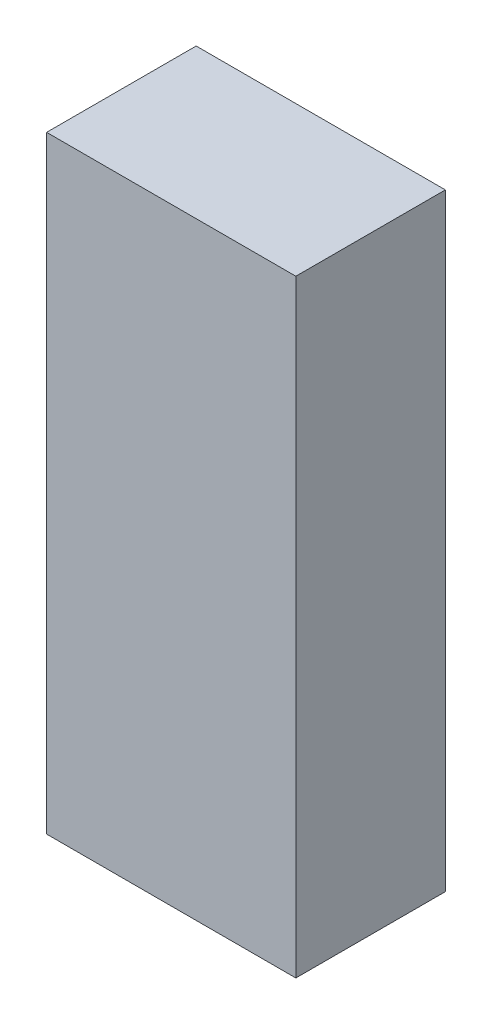
ISO-10303-21;
HEADER;
FILE_DESCRIPTION(('STEP AP214'),'2;1');
FILE_NAME('part.step','',(''),(''),'','','');
FILE_SCHEMA(('AUTOMOTIVE_DESIGN { 1 0 10303 214 1 1 1 1 }'));
ENDSEC;
DATA;
#1=APPLICATION_CONTEXT('core data for automotive mechanical design processes');
#2=APPLICATION_PROTOCOL_DEFINITION('international standard','automotive_design',2000,#1);
#3=PRODUCT_CONTEXT('',#1,'mechanical');
#4=PRODUCT('Part','Part','',(#3));
#5=PRODUCT_RELATED_PRODUCT_CATEGORY('part','',(#4));
#6=PRODUCT_DEFINITION_FORMATION('','',#4);
#7=PRODUCT_DEFINITION_CONTEXT('part definition',#1,'design');
#8=PRODUCT_DEFINITION('design','',#6,#7);
#9=PRODUCT_DEFINITION_SHAPE('','',#8);
#10=(LENGTH_UNIT() NAMED_UNIT(*) SI_UNIT(.MILLI.,.METRE.));
#11=(NAMED_UNIT(*) PLANE_ANGLE_UNIT() SI_UNIT($,.RADIAN.));
#12=(NAMED_UNIT(*) SI_UNIT($,.STERADIAN.) SOLID_ANGLE_UNIT());
#13=UNCERTAINTY_MEASURE_WITH_UNIT(LENGTH_MEASURE(1.E-05),#10,'distance_accuracy_value','');
#14=(GEOMETRIC_REPRESENTATION_CONTEXT(3) GLOBAL_UNCERTAINTY_ASSIGNED_CONTEXT((#13)) GLOBAL_UNIT_ASSIGNED_CONTEXT((#10,
#11,#12)) REPRESENTATION_CONTEXT('',''));
#15=CARTESIAN_POINT('',(0.,0.,0.));
#16=DIRECTION('',(0.,0.,1.));
#17=DIRECTION('',(1.,0.,0.));
#18=AXIS2_PLACEMENT_3D('',#15,#16,#17);
#19=CARTESIAN_POINT('',(7.75,-18.9,9.3));
#20=DIRECTION('',(-1.,0.,0.));
#21=DIRECTION('',(0.,0.,1.));
#22=AXIS2_PLACEMENT_3D('',#19,#20,#21);
#23=PLANE('',#22);
#24=DIRECTION('',(0.,1.,0.));
#25=VECTOR('',#24,1.);
#26=CARTESIAN_POINT('',(7.75,-18.9,0.));
#27=LINE('',#26,#25);
#28=CARTESIAN_POINT('',(7.75,-18.9,0.));
#29=VERTEX_POINT('',#28);
#30=CARTESIAN_POINT('',(7.75,18.9,0.));
#31=VERTEX_POINT('',#30);
#32=EDGE_CURVE('E102',#29,#31,#27,.T.);
#33=ORIENTED_EDGE('',*,*,#32,.T.);
#34=DIRECTION('',(0.,0.,-1.));
#35=VECTOR('',#34,1.);
#36=CARTESIAN_POINT('',(7.75,18.9,9.3));
#37=LINE('',#36,#35);
#38=CARTESIAN_POINT('',(7.75,18.9,9.3));
#39=VERTEX_POINT('',#38);
#40=EDGE_CURVE('E11',#39,#31,#37,.T.);
#41=ORIENTED_EDGE('',*,*,#40,.F.);
#42=DIRECTION('',(0.,1.,0.));
#43=VECTOR('',#42,1.);
#44=CARTESIAN_POINT('',(7.75,-18.9,9.3));
#45=LINE('',#44,#43);
#46=CARTESIAN_POINT('',(7.75,-18.9,9.3));
#47=VERTEX_POINT('',#46);
#48=EDGE_CURVE('E90',#47,#39,#45,.T.);
#49=ORIENTED_EDGE('',*,*,#48,.F.);
#50=DIRECTION('',(0.,0.,-1.));
#51=VECTOR('',#50,1.);
#52=CARTESIAN_POINT('',(7.75,-18.9,9.3));
#53=LINE('',#52,#51);
#54=EDGE_CURVE('E98',#47,#29,#53,.T.);
#55=ORIENTED_EDGE('',*,*,#54,.T.);
#56=EDGE_LOOP('',(#33,#41,#49,#55));
#57=FACE_BOUND('',#56,.T.);
#58=ADVANCED_FACE('F39',(#57),#23,.F.);
#59=CARTESIAN_POINT('',(-7.75,18.9,9.3));
#60=DIRECTION('',(0.,-1.,0.));
#61=DIRECTION('',(0.,0.,-1.));
#62=AXIS2_PLACEMENT_3D('',#59,#60,#61);
#63=PLANE('',#62);
#64=DIRECTION('',(-1.,0.,0.));
#65=VECTOR('',#64,1.);
#66=CARTESIAN_POINT('',(-7.75,18.9,0.));
#67=LINE('',#66,#65);
#68=CARTESIAN_POINT('',(-7.75,18.9,0.));
#69=VERTEX_POINT('',#68);
#70=EDGE_CURVE('E94',#31,#69,#67,.T.);
#71=ORIENTED_EDGE('',*,*,#70,.T.);
#72=DIRECTION('',(0.,0.,-1.));
#73=VECTOR('',#72,1.);
#74=CARTESIAN_POINT('',(-7.75,18.9,9.3));
#75=LINE('',#74,#73);
#76=CARTESIAN_POINT('',(-7.75,18.9,9.3));
#77=VERTEX_POINT('',#76);
#78=EDGE_CURVE('E47',#77,#69,#75,.T.);
#79=ORIENTED_EDGE('',*,*,#78,.F.);
#80=DIRECTION('',(-1.,0.,0.));
#81=VECTOR('',#80,1.);
#82=CARTESIAN_POINT('',(-7.75,18.9,9.3));
#83=LINE('',#82,#81);
#84=EDGE_CURVE('E85',#39,#77,#83,.T.);
#85=ORIENTED_EDGE('',*,*,#84,.F.);
#86=ORIENTED_EDGE('',*,*,#40,.T.);
#87=EDGE_LOOP('',(#71,#79,#85,#86));
#88=FACE_BOUND('',#87,.T.);
#89=ADVANCED_FACE('F93',(#88),#63,.F.);
#90=CARTESIAN_POINT('',(-7.75,-18.9,9.3));
#91=DIRECTION('',(1.,0.,0.));
#92=DIRECTION('',(0.,0.,-1.));
#93=AXIS2_PLACEMENT_3D('',#90,#91,#92);
#94=PLANE('',#93);
#95=DIRECTION('',(0.,-1.,0.));
#96=VECTOR('',#95,1.);
#97=CARTESIAN_POINT('',(-7.75,-18.9,0.));
#98=LINE('',#97,#96);
#99=CARTESIAN_POINT('',(-7.75,-18.9,0.));
#100=VERTEX_POINT('',#99);
#101=EDGE_CURVE('E72',#69,#100,#98,.T.);
#102=ORIENTED_EDGE('',*,*,#101,.T.);
#103=DIRECTION('',(0.,0.,-1.));
#104=VECTOR('',#103,1.);
#105=CARTESIAN_POINT('',(-7.75,-18.9,9.3));
#106=LINE('',#105,#104);
#107=CARTESIAN_POINT('',(-7.75,-18.9,9.3));
#108=VERTEX_POINT('',#107);
#109=EDGE_CURVE('E95',#108,#100,#106,.T.);
#110=ORIENTED_EDGE('',*,*,#109,.F.);
#111=DIRECTION('',(0.,-1.,0.));
#112=VECTOR('',#111,1.);
#113=CARTESIAN_POINT('',(-7.75,-18.9,9.3));
#114=LINE('',#113,#112);
#115=EDGE_CURVE('E88',#77,#108,#114,.T.);
#116=ORIENTED_EDGE('',*,*,#115,.F.);
#117=ORIENTED_EDGE('',*,*,#78,.T.);
#118=EDGE_LOOP('',(#102,#110,#116,#117));
#119=FACE_BOUND('',#118,.T.);
#120=ADVANCED_FACE('F96',(#119),#94,.F.);
#121=CARTESIAN_POINT('',(-7.75,-18.9,9.3));
#122=DIRECTION('',(0.,1.,0.));
#123=DIRECTION('',(0.,0.,1.));
#124=AXIS2_PLACEMENT_3D('',#121,#122,#123);
#125=PLANE('',#124);
#126=DIRECTION('',(1.,0.,0.));
#127=VECTOR('',#126,1.);
#128=CARTESIAN_POINT('',(-7.75,-18.9,0.));
#129=LINE('',#128,#127);
#130=EDGE_CURVE('E78',#100,#29,#129,.T.);
#131=ORIENTED_EDGE('',*,*,#130,.T.);
#132=ORIENTED_EDGE('',*,*,#54,.F.);
#133=DIRECTION('',(1.,0.,0.));
#134=VECTOR('',#133,1.);
#135=CARTESIAN_POINT('',(-7.75,-18.9,9.3));
#136=LINE('',#135,#134);
#137=EDGE_CURVE('E55',#108,#47,#136,.T.);
#138=ORIENTED_EDGE('',*,*,#137,.F.);
#139=ORIENTED_EDGE('',*,*,#109,.T.);
#140=EDGE_LOOP('',(#131,#132,#138,#139));
#141=FACE_BOUND('',#140,.T.);
#142=ADVANCED_FACE('F109',(#141),#125,.F.);
#143=CARTESIAN_POINT('',(0.,0.,9.3));
#144=DIRECTION('',(0.,0.,-1.));
#145=DIRECTION('',(-1.,0.,0.));
#146=AXIS2_PLACEMENT_3D('',#143,#144,#145);
#147=PLANE('',#146);
#148=ORIENTED_EDGE('',*,*,#48,.T.);
#149=ORIENTED_EDGE('',*,*,#84,.T.);
#150=ORIENTED_EDGE('',*,*,#115,.T.);
#151=ORIENTED_EDGE('',*,*,#137,.T.);
#152=EDGE_LOOP('',(#148,#149,#150,#151));
#153=FACE_BOUND('',#152,.T.);
#154=ADVANCED_FACE('F86',(#153),#147,.F.);
#155=CARTESIAN_POINT('',(0.,0.,0.));
#156=DIRECTION('',(0.,0.,-1.));
#157=DIRECTION('',(-1.,0.,0.));
#158=AXIS2_PLACEMENT_3D('',#155,#156,#157);
#159=PLANE('',#158);
#160=ORIENTED_EDGE('',*,*,#32,.F.);
#161=ORIENTED_EDGE('',*,*,#130,.F.);
#162=ORIENTED_EDGE('',*,*,#101,.F.);
#163=ORIENTED_EDGE('',*,*,#70,.F.);
#164=EDGE_LOOP('',(#160,#161,#162,#163));
#165=FACE_BOUND('',#164,.T.);
#166=ADVANCED_FACE('F112',(#165),#159,.T.);
#167=CLOSED_SHELL('',(#58,#89,#120,#142,#154,#166));
#168=MANIFOLD_SOLID_BREP('B2',#167);
#169=ADVANCED_BREP_SHAPE_REPRESENTATION('',(#18,#168),#14);
#170=SHAPE_DEFINITION_REPRESENTATION(#9,#169);
ENDSEC;
END-ISO-10303-21;
